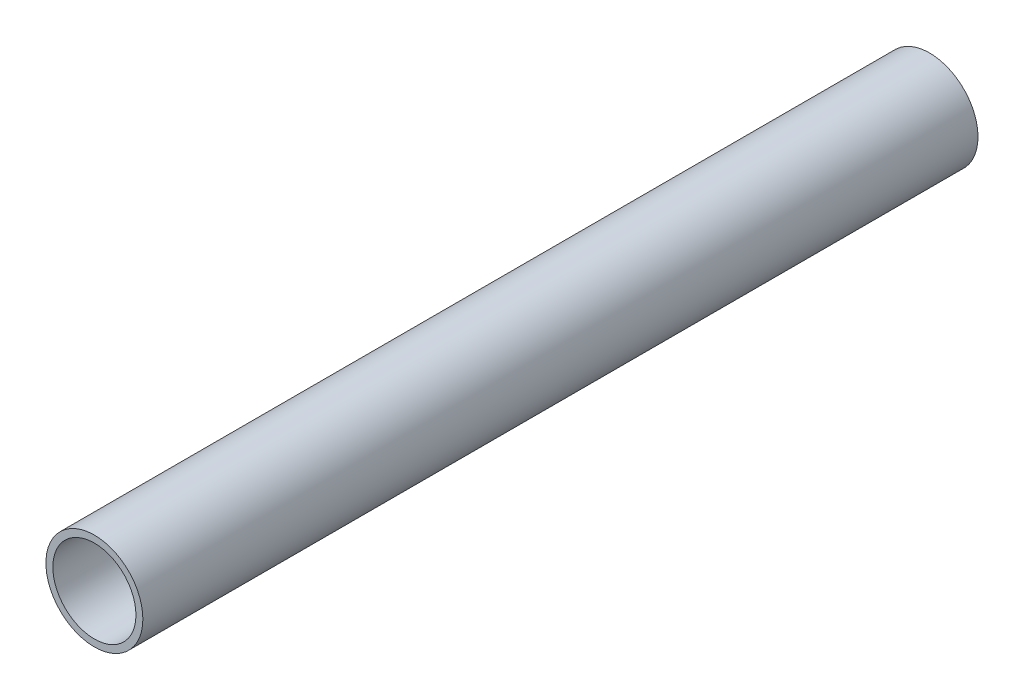
ISO-10303-21;
HEADER;
FILE_DESCRIPTION(('STEP AP214'),'2;1');
FILE_NAME('part.step','',(''),(''),'','','');
FILE_SCHEMA(('AUTOMOTIVE_DESIGN { 1 0 10303 214 1 1 1 1 }'));
ENDSEC;
DATA;
#1=APPLICATION_CONTEXT('core data for automotive mechanical design processes');
#2=APPLICATION_PROTOCOL_DEFINITION('international standard','automotive_design',2000,#1);
#3=PRODUCT_CONTEXT('',#1,'mechanical');
#4=PRODUCT('Part','Part','',(#3));
#5=PRODUCT_RELATED_PRODUCT_CATEGORY('part','',(#4));
#6=PRODUCT_DEFINITION_FORMATION('','',#4);
#7=PRODUCT_DEFINITION_CONTEXT('part definition',#1,'design');
#8=PRODUCT_DEFINITION('design','',#6,#7);
#9=PRODUCT_DEFINITION_SHAPE('','',#8);
#10=(LENGTH_UNIT() NAMED_UNIT(*) SI_UNIT(.MILLI.,.METRE.));
#11=(NAMED_UNIT(*) PLANE_ANGLE_UNIT() SI_UNIT($,.RADIAN.));
#12=(NAMED_UNIT(*) SI_UNIT($,.STERADIAN.) SOLID_ANGLE_UNIT());
#13=UNCERTAINTY_MEASURE_WITH_UNIT(LENGTH_MEASURE(1.E-05),#10,'distance_accuracy_value','');
#14=(GEOMETRIC_REPRESENTATION_CONTEXT(3) GLOBAL_UNCERTAINTY_ASSIGNED_CONTEXT((#13)) GLOBAL_UNIT_ASSIGNED_CONTEXT((#10,
#11,#12)) REPRESENTATION_CONTEXT('',''));
#15=CARTESIAN_POINT('',(0.,0.,0.));
#16=DIRECTION('',(0.,0.,1.));
#17=DIRECTION('',(1.,0.,0.));
#18=AXIS2_PLACEMENT_3D('',#15,#16,#17);
#19=CARTESIAN_POINT('',(0.,0.,95.717017989));
#20=DIRECTION('',(0.,0.,1.));
#21=DIRECTION('',(1.,0.,0.));
#22=AXIS2_PLACEMENT_3D('',#19,#20,#21);
#23=PLANE('',#22);
#24=CARTESIAN_POINT('',(0.,0.,95.717017989));
#25=DIRECTION('',(0.,0.,1.));
#26=DIRECTION('',(1.,0.,0.));
#27=AXIS2_PLACEMENT_3D('',#24,#25,#26);
#28=CIRCLE('',#27,11.1125);
#29=CARTESIAN_POINT('',(11.1125,0.,95.717017989));
#30=VERTEX_POINT('',#29);
#31=EDGE_CURVE('E10',#30,#30,#28,.T.);
#32=ORIENTED_EDGE('',*,*,#31,.T.);
#33=EDGE_LOOP('',(#32));
#34=FACE_BOUND('',#33,.T.);
#35=CARTESIAN_POINT('',(0.,0.,95.717017989));
#36=DIRECTION('',(0.,0.,1.));
#37=DIRECTION('',(1.,0.,0.));
#38=AXIS2_PLACEMENT_3D('',#35,#36,#37);
#39=CIRCLE('',#38,9.525);
#40=CARTESIAN_POINT('',(9.525,0.,95.717017989));
#41=VERTEX_POINT('',#40);
#42=EDGE_CURVE('E45',#41,#41,#39,.T.);
#43=ORIENTED_EDGE('',*,*,#42,.F.);
#44=EDGE_LOOP('',(#43));
#45=FACE_BOUND('',#44,.T.);
#46=ADVANCED_FACE('F34',(#34,#45),#23,.T.);
#47=CARTESIAN_POINT('',(0.,0.,-95.717017989));
#48=DIRECTION('',(0.,0.,1.));
#49=DIRECTION('',(1.,0.,0.));
#50=AXIS2_PLACEMENT_3D('',#47,#48,#49);
#51=PLANE('',#50);
#52=CARTESIAN_POINT('',(0.,0.,-95.717017989));
#53=DIRECTION('',(0.,0.,1.));
#54=DIRECTION('',(1.,0.,0.));
#55=AXIS2_PLACEMENT_3D('',#52,#53,#54);
#56=CIRCLE('',#55,11.1125);
#57=CARTESIAN_POINT('',(11.1125,0.,-95.717017989));
#58=VERTEX_POINT('',#57);
#59=EDGE_CURVE('E38',#58,#58,#56,.T.);
#60=ORIENTED_EDGE('',*,*,#59,.F.);
#61=EDGE_LOOP('',(#60));
#62=FACE_BOUND('',#61,.T.);
#63=CARTESIAN_POINT('',(0.,0.,-95.717017989));
#64=DIRECTION('',(0.,0.,1.));
#65=DIRECTION('',(1.,0.,0.));
#66=AXIS2_PLACEMENT_3D('',#63,#64,#65);
#67=CIRCLE('',#66,9.525);
#68=CARTESIAN_POINT('',(9.525,0.,-95.717017989));
#69=VERTEX_POINT('',#68);
#70=EDGE_CURVE('E47',#69,#69,#67,.T.);
#71=ORIENTED_EDGE('',*,*,#70,.T.);
#72=EDGE_LOOP('',(#71));
#73=FACE_BOUND('',#72,.T.);
#74=ADVANCED_FACE('F57',(#62,#73),#51,.F.);
#75=CARTESIAN_POINT('',(0.,0.,95.717017989));
#76=DIRECTION('',(0.,0.,-1.));
#77=DIRECTION('',(-1.,0.,0.));
#78=AXIS2_PLACEMENT_3D('',#75,#76,#77);
#79=CYLINDRICAL_SURFACE('',#78,11.1125);
#80=ORIENTED_EDGE('',*,*,#31,.F.);
#81=EDGE_LOOP('',(#80));
#82=FACE_BOUND('',#81,.T.);
#83=ORIENTED_EDGE('',*,*,#59,.T.);
#84=EDGE_LOOP('',(#83));
#85=FACE_BOUND('',#84,.T.);
#86=ADVANCED_FACE('F36',(#82,#85),#79,.T.);
#87=CARTESIAN_POINT('',(0.,0.,95.717017989));
#88=DIRECTION('',(0.,0.,-1.));
#89=DIRECTION('',(-1.,0.,0.));
#90=AXIS2_PLACEMENT_3D('',#87,#88,#89);
#91=CYLINDRICAL_SURFACE('',#90,9.525);
#92=ORIENTED_EDGE('',*,*,#42,.T.);
#93=EDGE_LOOP('',(#92));
#94=FACE_BOUND('',#93,.T.);
#95=ORIENTED_EDGE('',*,*,#70,.F.);
#96=EDGE_LOOP('',(#95));
#97=FACE_BOUND('',#96,.T.);
#98=ADVANCED_FACE('F53',(#94,#97),#91,.F.);
#99=CLOSED_SHELL('',(#46,#74,#86,#98));
#100=MANIFOLD_SOLID_BREP('B2',#99);
#101=ADVANCED_BREP_SHAPE_REPRESENTATION('',(#18,#100),#14);
#102=SHAPE_DEFINITION_REPRESENTATION(#9,#101);
ENDSEC;
END-ISO-10303-21;
